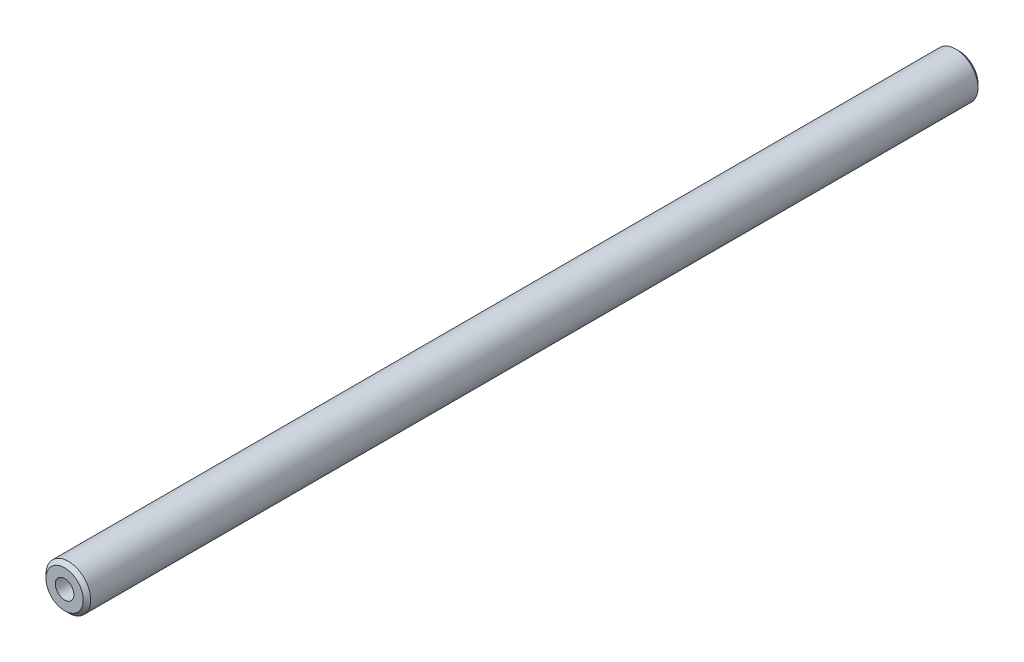
ISO-10303-21;
HEADER;
FILE_DESCRIPTION(('STEP AP214'),'2;1');
FILE_NAME('part.step','',(''),(''),'','','');
FILE_SCHEMA(('AUTOMOTIVE_DESIGN { 1 0 10303 214 1 1 1 1 }'));
ENDSEC;
DATA;
#1=APPLICATION_CONTEXT('core data for automotive mechanical design processes');
#2=APPLICATION_PROTOCOL_DEFINITION('international standard','automotive_design',2000,#1);
#3=PRODUCT_CONTEXT('',#1,'mechanical');
#4=PRODUCT('Part','Part','',(#3));
#5=PRODUCT_RELATED_PRODUCT_CATEGORY('part','',(#4));
#6=PRODUCT_DEFINITION_FORMATION('','',#4);
#7=PRODUCT_DEFINITION_CONTEXT('part definition',#1,'design');
#8=PRODUCT_DEFINITION('design','',#6,#7);
#9=PRODUCT_DEFINITION_SHAPE('','',#8);
#10=(LENGTH_UNIT() NAMED_UNIT(*) SI_UNIT(.MILLI.,.METRE.));
#11=(NAMED_UNIT(*) PLANE_ANGLE_UNIT() SI_UNIT($,.RADIAN.));
#12=(NAMED_UNIT(*) SI_UNIT($,.STERADIAN.) SOLID_ANGLE_UNIT());
#13=UNCERTAINTY_MEASURE_WITH_UNIT(LENGTH_MEASURE(1.E-05),#10,'distance_accuracy_value','');
#14=(GEOMETRIC_REPRESENTATION_CONTEXT(3) GLOBAL_UNCERTAINTY_ASSIGNED_CONTEXT((#13)) GLOBAL_UNIT_ASSIGNED_CONTEXT((#10,
#11,#12)) REPRESENTATION_CONTEXT('',''));
#15=CARTESIAN_POINT('',(0.,0.,0.));
#16=DIRECTION('',(0.,0.,1.));
#17=DIRECTION('',(1.,0.,0.));
#18=AXIS2_PLACEMENT_3D('',#15,#16,#17);
#19=CARTESIAN_POINT('',(0.,0.,60.));
#20=DIRECTION('',(0.,0.,-1.));
#21=DIRECTION('',(-1.,0.,0.));
#22=AXIS2_PLACEMENT_3D('',#19,#20,#21);
#23=CYLINDRICAL_SURFACE('',#22,3.);
#24=CARTESIAN_POINT('',(0.,0.,-59.5));
#25=DIRECTION('',(0.,0.,1.));
#26=DIRECTION('',(1.,0.,0.));
#27=AXIS2_PLACEMENT_3D('',#24,#25,#26);
#28=CIRCLE('',#27,3.);
#29=CARTESIAN_POINT('',(3.,0.,-59.5));
#30=VERTEX_POINT('',#29);
#31=EDGE_CURVE('E77',#30,#30,#28,.T.);
#32=ORIENTED_EDGE('',*,*,#31,.T.);
#33=EDGE_LOOP('',(#32));
#34=FACE_BOUND('',#33,.T.);
#35=CARTESIAN_POINT('',(0.,0.,59.5));
#36=DIRECTION('',(0.,0.,1.));
#37=DIRECTION('',(1.,0.,0.));
#38=AXIS2_PLACEMENT_3D('',#35,#36,#37);
#39=CIRCLE('',#38,3.);
#40=CARTESIAN_POINT('',(3.,0.,59.5));
#41=VERTEX_POINT('',#40);
#42=EDGE_CURVE('E74',#41,#41,#39,.F.);
#43=ORIENTED_EDGE('',*,*,#42,.T.);
#44=EDGE_LOOP('',(#43));
#45=FACE_BOUND('',#44,.T.);
#46=ADVANCED_FACE('F39',(#34,#45),#23,.T.);
#47=CARTESIAN_POINT('',(0.,0.,60.));
#48=DIRECTION('',(0.,0.,1.));
#49=DIRECTION('',(1.,0.,0.));
#50=AXIS2_PLACEMENT_3D('',#47,#48,#49);
#51=PLANE('',#50);
#52=CARTESIAN_POINT('',(0.,0.,60.));
#53=DIRECTION('',(0.,0.,1.));
#54=DIRECTION('',(1.,0.,0.));
#55=AXIS2_PLACEMENT_3D('',#52,#53,#54);
#56=CIRCLE('',#55,1.24999999999999);
#57=CARTESIAN_POINT('',(1.24999999999999,0.,60.));
#58=VERTEX_POINT('',#57);
#59=EDGE_CURVE('E63',#58,#58,#56,.T.);
#60=ORIENTED_EDGE('',*,*,#59,.F.);
#61=EDGE_LOOP('',(#60));
#62=FACE_BOUND('',#61,.T.);
#63=CARTESIAN_POINT('',(0.,0.,60.));
#64=DIRECTION('',(0.,0.,1.));
#65=DIRECTION('',(1.,0.,0.));
#66=AXIS2_PLACEMENT_3D('',#63,#64,#65);
#67=CIRCLE('',#66,2.49999999999999);
#68=CARTESIAN_POINT('',(2.49999999999999,0.,60.));
#69=VERTEX_POINT('',#68);
#70=EDGE_CURVE('E11',#69,#69,#67,.T.);
#71=ORIENTED_EDGE('',*,*,#70,.T.);
#72=EDGE_LOOP('',(#71));
#73=FACE_BOUND('',#72,.T.);
#74=ADVANCED_FACE('F91',(#62,#73),#51,.T.);
#75=CARTESIAN_POINT('',(0.,0.,-60.));
#76=DIRECTION('',(0.,0.,1.));
#77=DIRECTION('',(1.,0.,0.));
#78=AXIS2_PLACEMENT_3D('',#75,#76,#77);
#79=PLANE('',#78);
#80=CARTESIAN_POINT('',(0.,0.,-60.));
#81=DIRECTION('',(0.,0.,-1.));
#82=DIRECTION('',(-1.,0.,0.));
#83=AXIS2_PLACEMENT_3D('',#80,#81,#82);
#84=CIRCLE('',#83,1.24999999999999);
#85=CARTESIAN_POINT('',(-1.24999999999999,0.,-60.));
#86=VERTEX_POINT('',#85);
#87=EDGE_CURVE('E64',#86,#86,#84,.T.);
#88=ORIENTED_EDGE('',*,*,#87,.F.);
#89=EDGE_LOOP('',(#88));
#90=FACE_BOUND('',#89,.T.);
#91=CARTESIAN_POINT('',(0.,0.,-60.));
#92=DIRECTION('',(0.,0.,1.));
#93=DIRECTION('',(1.,0.,0.));
#94=AXIS2_PLACEMENT_3D('',#91,#92,#93);
#95=CIRCLE('',#94,2.5);
#96=CARTESIAN_POINT('',(2.5,0.,-60.));
#97=VERTEX_POINT('',#96);
#98=EDGE_CURVE('E47',#97,#97,#95,.F.);
#99=ORIENTED_EDGE('',*,*,#98,.T.);
#100=EDGE_LOOP('',(#99));
#101=FACE_BOUND('',#100,.T.);
#102=ADVANCED_FACE('F82',(#90,#101),#79,.F.);
#103=CARTESIAN_POINT('',(0.,0.,-59.5));
#104=DIRECTION('',(0.,0.,1.));
#105=DIRECTION('',(1.,0.,0.));
#106=AXIS2_PLACEMENT_3D('',#103,#104,#105);
#107=CONICAL_SURFACE('',#106,3.,0.785398163397446);
#108=ORIENTED_EDGE('',*,*,#98,.F.);
#109=EDGE_LOOP('',(#108));
#110=FACE_BOUND('',#109,.T.);
#111=ORIENTED_EDGE('',*,*,#31,.F.);
#112=EDGE_LOOP('',(#111));
#113=FACE_BOUND('',#112,.T.);
#114=ADVANCED_FACE('F84',(#110,#113),#107,.T.);
#115=CARTESIAN_POINT('',(0.,0.,60.));
#116=DIRECTION('',(0.,0.,-1.));
#117=DIRECTION('',(-1.,0.,0.));
#118=AXIS2_PLACEMENT_3D('',#115,#116,#117);
#119=CONICAL_SURFACE('',#118,2.49999999999999,0.785398163397453);
#120=ORIENTED_EDGE('',*,*,#42,.F.);
#121=EDGE_LOOP('',(#120));
#122=FACE_BOUND('',#121,.T.);
#123=ORIENTED_EDGE('',*,*,#70,.F.);
#124=EDGE_LOOP('',(#123));
#125=FACE_BOUND('',#124,.T.);
#126=ADVANCED_FACE('F41',(#122,#125),#119,.T.);
#127=CARTESIAN_POINT('',(0.,0.,51.5));
#128=DIRECTION('',(0.,0.,1.));
#129=DIRECTION('',(1.,0.,0.));
#130=AXIS2_PLACEMENT_3D('',#127,#128,#129);
#131=CONICAL_SURFACE('',#130,1.24999999999999,1.02974425867665);
#132=CARTESIAN_POINT('',(0.,0.,50.7489242262155));
#133=VERTEX_POINT('',#132);
#134=VERTEX_LOOP('',#133);
#135=FACE_BOUND('',#134,.T.);
#136=CARTESIAN_POINT('',(0.,0.,51.5));
#137=DIRECTION('',(0.,0.,1.));
#138=DIRECTION('',(1.,0.,0.));
#139=AXIS2_PLACEMENT_3D('',#136,#137,#138);
#140=CIRCLE('',#139,1.24999999999999);
#141=CARTESIAN_POINT('',(1.24999999999999,0.,51.5));
#142=VERTEX_POINT('',#141);
#143=EDGE_CURVE('E67',#142,#142,#140,.T.);
#144=ORIENTED_EDGE('',*,*,#143,.T.);
#145=EDGE_LOOP('',(#144));
#146=FACE_BOUND('',#145,.T.);
#147=ADVANCED_FACE('F97',(#135,#146),#131,.F.);
#148=CARTESIAN_POINT('',(0.,0.,60.));
#149=DIRECTION('',(0.,0.,1.));
#150=DIRECTION('',(1.,0.,0.));
#151=AXIS2_PLACEMENT_3D('',#148,#149,#150);
#152=CYLINDRICAL_SURFACE('',#151,1.24999999999999);
#153=ORIENTED_EDGE('',*,*,#143,.F.);
#154=EDGE_LOOP('',(#153));
#155=FACE_BOUND('',#154,.T.);
#156=ORIENTED_EDGE('',*,*,#59,.T.);
#157=EDGE_LOOP('',(#156));
#158=FACE_BOUND('',#157,.T.);
#159=ADVANCED_FACE('F57',(#155,#158),#152,.F.);
#160=CARTESIAN_POINT('',(0.,0.,-51.5));
#161=DIRECTION('',(0.,0.,-1.));
#162=DIRECTION('',(-1.,0.,0.));
#163=AXIS2_PLACEMENT_3D('',#160,#161,#162);
#164=CONICAL_SURFACE('',#163,1.24999999999999,1.02974425867665);
#165=CARTESIAN_POINT('',(0.,0.,-50.7489242262155));
#166=VERTEX_POINT('',#165);
#167=VERTEX_LOOP('',#166);
#168=FACE_BOUND('',#167,.T.);
#169=CARTESIAN_POINT('',(0.,0.,-51.5));
#170=DIRECTION('',(0.,0.,-1.));
#171=DIRECTION('',(-1.,0.,0.));
#172=AXIS2_PLACEMENT_3D('',#169,#170,#171);
#173=CIRCLE('',#172,1.24999999999999);
#174=CARTESIAN_POINT('',(-1.24999999999999,0.,-51.5));
#175=VERTEX_POINT('',#174);
#176=EDGE_CURVE('E61',#175,#175,#173,.T.);
#177=ORIENTED_EDGE('',*,*,#176,.T.);
#178=EDGE_LOOP('',(#177));
#179=FACE_BOUND('',#178,.T.);
#180=ADVANCED_FACE('F53',(#168,#179),#164,.F.);
#181=CARTESIAN_POINT('',(0.,0.,-60.));
#182=DIRECTION('',(0.,0.,-1.));
#183=DIRECTION('',(-1.,0.,0.));
#184=AXIS2_PLACEMENT_3D('',#181,#182,#183);
#185=CYLINDRICAL_SURFACE('',#184,1.24999999999999);
#186=ORIENTED_EDGE('',*,*,#176,.F.);
#187=EDGE_LOOP('',(#186));
#188=FACE_BOUND('',#187,.T.);
#189=ORIENTED_EDGE('',*,*,#87,.T.);
#190=EDGE_LOOP('',(#189));
#191=FACE_BOUND('',#190,.T.);
#192=ADVANCED_FACE('F56',(#188,#191),#185,.F.);
#193=CLOSED_SHELL('',(#46,#74,#102,#114,#126,#147,#159,#180,#192));
#194=MANIFOLD_SOLID_BREP('B2',#193);
#195=ADVANCED_BREP_SHAPE_REPRESENTATION('',(#18,#194),#14);
#196=SHAPE_DEFINITION_REPRESENTATION(#9,#195);
ENDSEC;
END-ISO-10303-21;
